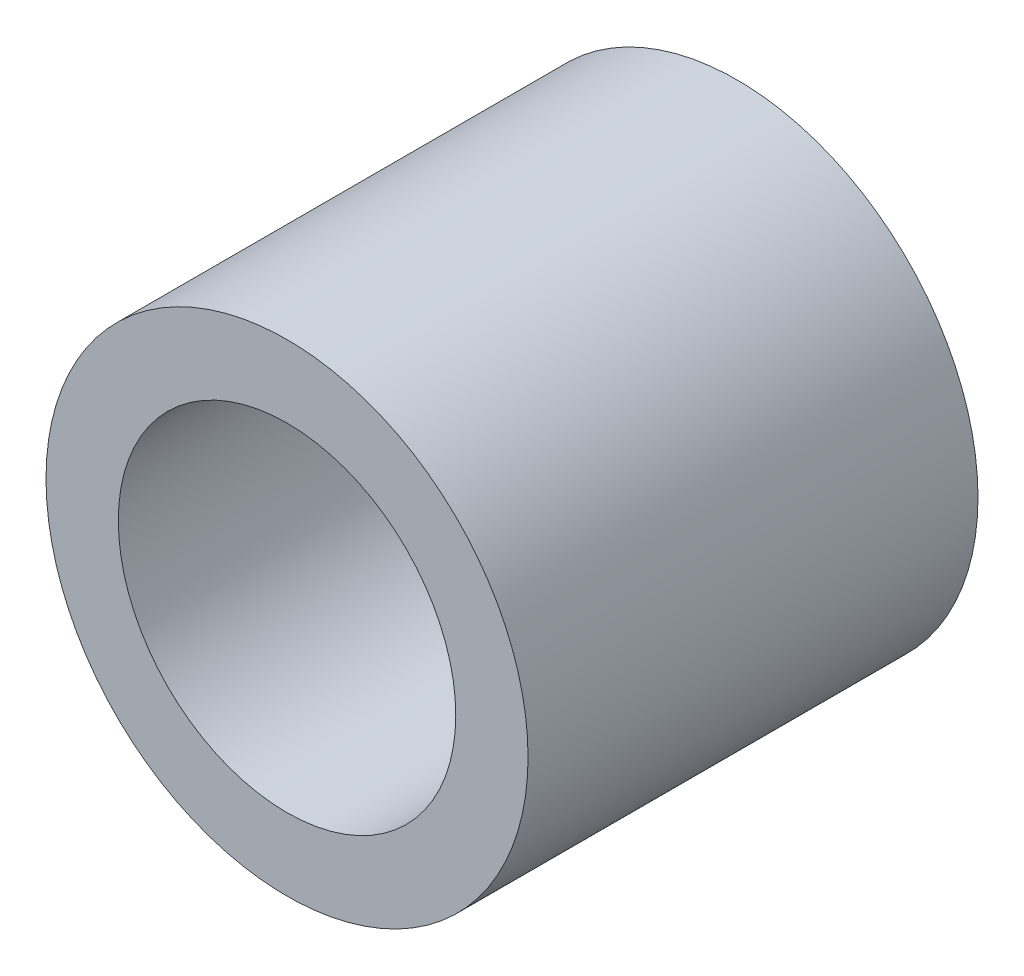
ISO-10303-21;
HEADER;
FILE_DESCRIPTION(('STEP AP214'),'2;1');
FILE_NAME('part.step','',(''),(''),'','','');
FILE_SCHEMA(('AUTOMOTIVE_DESIGN { 1 0 10303 214 1 1 1 1 }'));
ENDSEC;
DATA;
#1=APPLICATION_CONTEXT('core data for automotive mechanical design processes');
#2=APPLICATION_PROTOCOL_DEFINITION('international standard','automotive_design',2000,#1);
#3=PRODUCT_CONTEXT('',#1,'mechanical');
#4=PRODUCT('Part','Part','',(#3));
#5=PRODUCT_RELATED_PRODUCT_CATEGORY('part','',(#4));
#6=PRODUCT_DEFINITION_FORMATION('','',#4);
#7=PRODUCT_DEFINITION_CONTEXT('part definition',#1,'design');
#8=PRODUCT_DEFINITION('design','',#6,#7);
#9=PRODUCT_DEFINITION_SHAPE('','',#8);
#10=(LENGTH_UNIT() NAMED_UNIT(*) SI_UNIT(.MILLI.,.METRE.));
#11=(NAMED_UNIT(*) PLANE_ANGLE_UNIT() SI_UNIT($,.RADIAN.));
#12=(NAMED_UNIT(*) SI_UNIT($,.STERADIAN.) SOLID_ANGLE_UNIT());
#13=UNCERTAINTY_MEASURE_WITH_UNIT(LENGTH_MEASURE(1.E-05),#10,'distance_accuracy_value','');
#14=(GEOMETRIC_REPRESENTATION_CONTEXT(3) GLOBAL_UNCERTAINTY_ASSIGNED_CONTEXT((#13)) GLOBAL_UNIT_ASSIGNED_CONTEXT((#10,
#11,#12)) REPRESENTATION_CONTEXT('',''));
#15=CARTESIAN_POINT('',(0.,0.,0.));
#16=DIRECTION('',(0.,0.,1.));
#17=DIRECTION('',(1.,0.,0.));
#18=AXIS2_PLACEMENT_3D('',#15,#16,#17);
#19=CARTESIAN_POINT('',(0.,0.,7.));
#20=DIRECTION('',(0.,0.,1.));
#21=DIRECTION('',(1.,0.,0.));
#22=AXIS2_PLACEMENT_3D('',#19,#20,#21);
#23=PLANE('',#22);
#24=CARTESIAN_POINT('',(0.,0.,7.));
#25=DIRECTION('',(0.,0.,1.));
#26=DIRECTION('',(1.,0.,0.));
#27=AXIS2_PLACEMENT_3D('',#24,#25,#26);
#28=CIRCLE('',#27,7.5);
#29=CARTESIAN_POINT('',(7.5,0.,7.));
#30=VERTEX_POINT('',#29);
#31=EDGE_CURVE('E10',#30,#30,#28,.T.);
#32=ORIENTED_EDGE('',*,*,#31,.T.);
#33=EDGE_LOOP('',(#32));
#34=FACE_BOUND('',#33,.T.);
#35=CARTESIAN_POINT('',(0.,0.,7.));
#36=DIRECTION('',(0.,0.,1.));
#37=DIRECTION('',(1.,0.,0.));
#38=AXIS2_PLACEMENT_3D('',#35,#36,#37);
#39=CIRCLE('',#38,5.25);
#40=CARTESIAN_POINT('',(5.25,0.,7.));
#41=VERTEX_POINT('',#40);
#42=EDGE_CURVE('E41',#41,#41,#39,.T.);
#43=ORIENTED_EDGE('',*,*,#42,.F.);
#44=EDGE_LOOP('',(#43));
#45=FACE_BOUND('',#44,.T.);
#46=ADVANCED_FACE('F30',(#34,#45),#23,.T.);
#47=CARTESIAN_POINT('',(0.,0.,-7.));
#48=DIRECTION('',(0.,0.,1.));
#49=DIRECTION('',(1.,0.,0.));
#50=AXIS2_PLACEMENT_3D('',#47,#48,#49);
#51=PLANE('',#50);
#52=CARTESIAN_POINT('',(0.,0.,-7.));
#53=DIRECTION('',(0.,0.,1.));
#54=DIRECTION('',(1.,0.,0.));
#55=AXIS2_PLACEMENT_3D('',#52,#53,#54);
#56=CIRCLE('',#55,7.5);
#57=CARTESIAN_POINT('',(7.5,0.,-7.));
#58=VERTEX_POINT('',#57);
#59=EDGE_CURVE('E34',#58,#58,#56,.T.);
#60=ORIENTED_EDGE('',*,*,#59,.F.);
#61=EDGE_LOOP('',(#60));
#62=FACE_BOUND('',#61,.T.);
#63=CARTESIAN_POINT('',(0.,0.,-7.));
#64=DIRECTION('',(0.,0.,1.));
#65=DIRECTION('',(1.,0.,0.));
#66=AXIS2_PLACEMENT_3D('',#63,#64,#65);
#67=CIRCLE('',#66,5.25);
#68=CARTESIAN_POINT('',(5.25,0.,-7.));
#69=VERTEX_POINT('',#68);
#70=EDGE_CURVE('E43',#69,#69,#67,.T.);
#71=ORIENTED_EDGE('',*,*,#70,.T.);
#72=EDGE_LOOP('',(#71));
#73=FACE_BOUND('',#72,.T.);
#74=ADVANCED_FACE('F53',(#62,#73),#51,.F.);
#75=CARTESIAN_POINT('',(0.,0.,7.));
#76=DIRECTION('',(0.,0.,-1.));
#77=DIRECTION('',(-1.,0.,0.));
#78=AXIS2_PLACEMENT_3D('',#75,#76,#77);
#79=CYLINDRICAL_SURFACE('',#78,7.5);
#80=ORIENTED_EDGE('',*,*,#31,.F.);
#81=EDGE_LOOP('',(#80));
#82=FACE_BOUND('',#81,.T.);
#83=ORIENTED_EDGE('',*,*,#59,.T.);
#84=EDGE_LOOP('',(#83));
#85=FACE_BOUND('',#84,.T.);
#86=ADVANCED_FACE('F32',(#82,#85),#79,.T.);
#87=CARTESIAN_POINT('',(0.,0.,7.));
#88=DIRECTION('',(0.,0.,-1.));
#89=DIRECTION('',(-1.,0.,0.));
#90=AXIS2_PLACEMENT_3D('',#87,#88,#89);
#91=CYLINDRICAL_SURFACE('',#90,5.25);
#92=ORIENTED_EDGE('',*,*,#42,.T.);
#93=EDGE_LOOP('',(#92));
#94=FACE_BOUND('',#93,.T.);
#95=ORIENTED_EDGE('',*,*,#70,.F.);
#96=EDGE_LOOP('',(#95));
#97=FACE_BOUND('',#96,.T.);
#98=ADVANCED_FACE('F49',(#94,#97),#91,.F.);
#99=CLOSED_SHELL('',(#46,#74,#86,#98));
#100=MANIFOLD_SOLID_BREP('B2',#99);
#101=ADVANCED_BREP_SHAPE_REPRESENTATION('',(#18,#100),#14);
#102=SHAPE_DEFINITION_REPRESENTATION(#9,#101);
ENDSEC;
END-ISO-10303-21;
